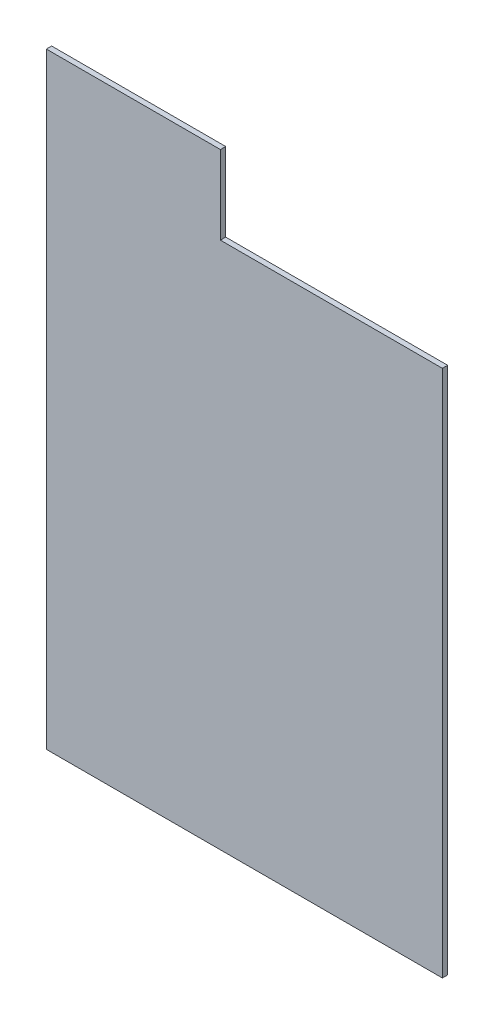
ISO-10303-21;
HEADER;
FILE_DESCRIPTION(('STEP AP214'),'2;1');
FILE_NAME('part.step','',(''),(''),'','','');
FILE_SCHEMA(('AUTOMOTIVE_DESIGN { 1 0 10303 214 1 1 1 1 }'));
ENDSEC;
DATA;
#1=APPLICATION_CONTEXT('core data for automotive mechanical design processes');
#2=APPLICATION_PROTOCOL_DEFINITION('international standard','automotive_design',2000,#1);
#3=PRODUCT_CONTEXT('',#1,'mechanical');
#4=PRODUCT('Part','Part','',(#3));
#5=PRODUCT_RELATED_PRODUCT_CATEGORY('part','',(#4));
#6=PRODUCT_DEFINITION_FORMATION('','',#4);
#7=PRODUCT_DEFINITION_CONTEXT('part definition',#1,'design');
#8=PRODUCT_DEFINITION('design','',#6,#7);
#9=PRODUCT_DEFINITION_SHAPE('','',#8);
#10=(LENGTH_UNIT() NAMED_UNIT(*) SI_UNIT(.MILLI.,.METRE.));
#11=(NAMED_UNIT(*) PLANE_ANGLE_UNIT() SI_UNIT($,.RADIAN.));
#12=(NAMED_UNIT(*) SI_UNIT($,.STERADIAN.) SOLID_ANGLE_UNIT());
#13=UNCERTAINTY_MEASURE_WITH_UNIT(LENGTH_MEASURE(1.E-05),#10,'distance_accuracy_value','');
#14=(GEOMETRIC_REPRESENTATION_CONTEXT(3) GLOBAL_UNCERTAINTY_ASSIGNED_CONTEXT((#13)) GLOBAL_UNIT_ASSIGNED_CONTEXT((#10,
#11,#12)) REPRESENTATION_CONTEXT('',''));
#15=CARTESIAN_POINT('',(0.,0.,0.));
#16=DIRECTION('',(0.,0.,1.));
#17=DIRECTION('',(1.,0.,0.));
#18=AXIS2_PLACEMENT_3D('',#15,#16,#17);
#19=CARTESIAN_POINT('',(0.,0.,1.));
#20=DIRECTION('',(0.,1.,0.));
#21=DIRECTION('',(0.,0.,1.));
#22=AXIS2_PLACEMENT_3D('',#19,#20,#21);
#23=PLANE('',#22);
#24=DIRECTION('',(1.,0.,0.));
#25=VECTOR('',#24,1.);
#26=CARTESIAN_POINT('',(0.,0.,0.));
#27=LINE('',#26,#25);
#28=CARTESIAN_POINT('',(0.,0.,0.));
#29=VERTEX_POINT('',#28);
#30=CARTESIAN_POINT('',(75.,0.,0.));
#31=VERTEX_POINT('',#30);
#32=EDGE_CURVE('E121',#29,#31,#27,.T.);
#33=ORIENTED_EDGE('',*,*,#32,.T.);
#34=DIRECTION('',(0.,0.,-1.));
#35=VECTOR('',#34,1.);
#36=CARTESIAN_POINT('',(75.,0.,1.));
#37=LINE('',#36,#35);
#38=CARTESIAN_POINT('',(75.,0.,1.));
#39=VERTEX_POINT('',#38);
#40=EDGE_CURVE('E41',#39,#31,#37,.T.);
#41=ORIENTED_EDGE('',*,*,#40,.F.);
#42=DIRECTION('',(1.,0.,0.));
#43=VECTOR('',#42,1.);
#44=CARTESIAN_POINT('',(0.,0.,1.));
#45=LINE('',#44,#43);
#46=CARTESIAN_POINT('',(0.,0.,1.));
#47=VERTEX_POINT('',#46);
#48=EDGE_CURVE('E87',#47,#39,#45,.T.);
#49=ORIENTED_EDGE('',*,*,#48,.F.);
#50=DIRECTION('',(0.,0.,-1.));
#51=VECTOR('',#50,1.);
#52=CARTESIAN_POINT('',(0.,0.,1.));
#53=LINE('',#52,#51);
#54=EDGE_CURVE('E11',#47,#29,#53,.T.);
#55=ORIENTED_EDGE('',*,*,#54,.T.);
#56=EDGE_LOOP('',(#33,#41,#49,#55));
#57=FACE_BOUND('',#56,.T.);
#58=ADVANCED_FACE('F33',(#57),#23,.F.);
#59=CARTESIAN_POINT('',(75.,0.,1.));
#60=DIRECTION('',(-1.,0.,0.));
#61=DIRECTION('',(0.,0.,1.));
#62=AXIS2_PLACEMENT_3D('',#59,#60,#61);
#63=PLANE('',#62);
#64=DIRECTION('',(0.,1.,0.));
#65=VECTOR('',#64,1.);
#66=CARTESIAN_POINT('',(75.,0.,0.));
#67=LINE('',#66,#65);
#68=CARTESIAN_POINT('',(75.,100.,0.));
#69=VERTEX_POINT('',#68);
#70=EDGE_CURVE('E123',#31,#69,#67,.T.);
#71=ORIENTED_EDGE('',*,*,#70,.T.);
#72=DIRECTION('',(0.,0.,-1.));
#73=VECTOR('',#72,1.);
#74=CARTESIAN_POINT('',(75.,100.,1.));
#75=LINE('',#74,#73);
#76=CARTESIAN_POINT('',(75.,100.,1.));
#77=VERTEX_POINT('',#76);
#78=EDGE_CURVE('E110',#77,#69,#75,.T.);
#79=ORIENTED_EDGE('',*,*,#78,.F.);
#80=DIRECTION('',(0.,1.,0.));
#81=VECTOR('',#80,1.);
#82=CARTESIAN_POINT('',(75.,0.,1.));
#83=LINE('',#82,#81);
#84=EDGE_CURVE('E101',#39,#77,#83,.T.);
#85=ORIENTED_EDGE('',*,*,#84,.F.);
#86=ORIENTED_EDGE('',*,*,#40,.T.);
#87=EDGE_LOOP('',(#71,#79,#85,#86));
#88=FACE_BOUND('',#87,.T.);
#89=ADVANCED_FACE('F135',(#88),#63,.F.);
#90=CARTESIAN_POINT('',(32.9665255734644,100.,1.));
#91=DIRECTION('',(0.,-1.,0.));
#92=DIRECTION('',(0.,0.,-1.));
#93=AXIS2_PLACEMENT_3D('',#90,#91,#92);
#94=PLANE('',#93);
#95=DIRECTION('',(-1.,0.,0.));
#96=VECTOR('',#95,1.);
#97=CARTESIAN_POINT('',(32.9665255734644,100.,0.));
#98=LINE('',#97,#96);
#99=CARTESIAN_POINT('',(32.9665255734644,100.,0.));
#100=VERTEX_POINT('',#99);
#101=EDGE_CURVE('E109',#69,#100,#98,.T.);
#102=ORIENTED_EDGE('',*,*,#101,.T.);
#103=DIRECTION('',(0.,0.,-1.));
#104=VECTOR('',#103,1.);
#105=CARTESIAN_POINT('',(32.9665255734644,100.,1.));
#106=LINE('',#105,#104);
#107=CARTESIAN_POINT('',(32.9665255734644,100.,1.));
#108=VERTEX_POINT('',#107);
#109=EDGE_CURVE('E106',#108,#100,#106,.T.);
#110=ORIENTED_EDGE('',*,*,#109,.F.);
#111=DIRECTION('',(-1.,0.,0.));
#112=VECTOR('',#111,1.);
#113=CARTESIAN_POINT('',(32.9665255734644,100.,1.));
#114=LINE('',#113,#112);
#115=EDGE_CURVE('E95',#77,#108,#114,.T.);
#116=ORIENTED_EDGE('',*,*,#115,.F.);
#117=ORIENTED_EDGE('',*,*,#78,.T.);
#118=EDGE_LOOP('',(#102,#110,#116,#117));
#119=FACE_BOUND('',#118,.T.);
#120=ADVANCED_FACE('F107',(#119),#94,.F.);
#121=CARTESIAN_POINT('',(32.9665255734644,114.863880064331,1.));
#122=DIRECTION('',(-1.,0.,0.));
#123=DIRECTION('',(0.,0.,1.));
#124=AXIS2_PLACEMENT_3D('',#121,#122,#123);
#125=PLANE('',#124);
#126=DIRECTION('',(0.,1.,0.));
#127=VECTOR('',#126,1.);
#128=CARTESIAN_POINT('',(32.9665255734644,114.863880064331,0.));
#129=LINE('',#128,#127);
#130=CARTESIAN_POINT('',(32.9665255734644,114.863880064331,0.));
#131=VERTEX_POINT('',#130);
#132=EDGE_CURVE('E73',#100,#131,#129,.T.);
#133=ORIENTED_EDGE('',*,*,#132,.T.);
#134=DIRECTION('',(0.,0.,-1.));
#135=VECTOR('',#134,1.);
#136=CARTESIAN_POINT('',(32.9665255734644,114.863880064331,1.));
#137=LINE('',#136,#135);
#138=CARTESIAN_POINT('',(32.9665255734644,114.863880064331,1.));
#139=VERTEX_POINT('',#138);
#140=EDGE_CURVE('E111',#139,#131,#137,.T.);
#141=ORIENTED_EDGE('',*,*,#140,.F.);
#142=DIRECTION('',(0.,1.,0.));
#143=VECTOR('',#142,1.);
#144=CARTESIAN_POINT('',(32.9665255734644,114.863880064331,1.));
#145=LINE('',#144,#143);
#146=EDGE_CURVE('E99',#108,#139,#145,.T.);
#147=ORIENTED_EDGE('',*,*,#146,.F.);
#148=ORIENTED_EDGE('',*,*,#109,.T.);
#149=EDGE_LOOP('',(#133,#141,#147,#148));
#150=FACE_BOUND('',#149,.T.);
#151=ADVANCED_FACE('F113',(#150),#125,.F.);
#152=CARTESIAN_POINT('',(0.,114.863880064331,1.));
#153=DIRECTION('',(0.,-1.,0.));
#154=DIRECTION('',(0.,0.,-1.));
#155=AXIS2_PLACEMENT_3D('',#152,#153,#154);
#156=PLANE('',#155);
#157=DIRECTION('',(-1.,0.,0.));
#158=VECTOR('',#157,1.);
#159=CARTESIAN_POINT('',(0.,114.863880064331,0.));
#160=LINE('',#159,#158);
#161=CARTESIAN_POINT('',(0.,114.863880064331,0.));
#162=VERTEX_POINT('',#161);
#163=EDGE_CURVE('E80',#131,#162,#160,.T.);
#164=ORIENTED_EDGE('',*,*,#163,.T.);
#165=DIRECTION('',(0.,0.,-1.));
#166=VECTOR('',#165,1.);
#167=CARTESIAN_POINT('',(0.,114.863880064331,1.));
#168=LINE('',#167,#166);
#169=CARTESIAN_POINT('',(0.,114.863880064331,1.));
#170=VERTEX_POINT('',#169);
#171=EDGE_CURVE('E117',#170,#162,#168,.T.);
#172=ORIENTED_EDGE('',*,*,#171,.F.);
#173=DIRECTION('',(-1.,0.,0.));
#174=VECTOR('',#173,1.);
#175=CARTESIAN_POINT('',(0.,114.863880064331,1.));
#176=LINE('',#175,#174);
#177=EDGE_CURVE('E115',#139,#170,#176,.T.);
#178=ORIENTED_EDGE('',*,*,#177,.F.);
#179=ORIENTED_EDGE('',*,*,#140,.T.);
#180=EDGE_LOOP('',(#164,#172,#178,#179));
#181=FACE_BOUND('',#180,.T.);
#182=ADVANCED_FACE('F141',(#181),#156,.F.);
#183=CARTESIAN_POINT('',(0.,100.,1.));
#184=DIRECTION('',(1.,0.,0.));
#185=DIRECTION('',(0.,0.,-1.));
#186=AXIS2_PLACEMENT_3D('',#183,#184,#185);
#187=PLANE('',#186);
#188=DIRECTION('',(0.,-1.,0.));
#189=VECTOR('',#188,1.);
#190=CARTESIAN_POINT('',(0.,100.,0.));
#191=LINE('',#190,#189);
#192=EDGE_CURVE('E128',#162,#29,#191,.T.);
#193=ORIENTED_EDGE('',*,*,#192,.T.);
#194=ORIENTED_EDGE('',*,*,#54,.F.);
#195=DIRECTION('',(0.,-1.,0.));
#196=VECTOR('',#195,1.);
#197=CARTESIAN_POINT('',(0.,0.,1.));
#198=LINE('',#197,#196);
#199=EDGE_CURVE('E49',#170,#47,#198,.T.);
#200=ORIENTED_EDGE('',*,*,#199,.F.);
#201=ORIENTED_EDGE('',*,*,#171,.T.);
#202=EDGE_LOOP('',(#193,#194,#200,#201));
#203=FACE_BOUND('',#202,.T.);
#204=ADVANCED_FACE('F140',(#203),#187,.F.);
#205=CARTESIAN_POINT('',(0.,0.,1.));
#206=DIRECTION('',(0.,0.,-1.));
#207=DIRECTION('',(-1.,0.,0.));
#208=AXIS2_PLACEMENT_3D('',#205,#206,#207);
#209=PLANE('',#208);
#210=ORIENTED_EDGE('',*,*,#199,.T.);
#211=ORIENTED_EDGE('',*,*,#48,.T.);
#212=ORIENTED_EDGE('',*,*,#84,.T.);
#213=ORIENTED_EDGE('',*,*,#115,.T.);
#214=ORIENTED_EDGE('',*,*,#146,.T.);
#215=ORIENTED_EDGE('',*,*,#177,.T.);
#216=EDGE_LOOP('',(#210,#211,#212,#213,#214,#215));
#217=FACE_BOUND('',#216,.T.);
#218=ADVANCED_FACE('F97',(#217),#209,.F.);
#219=CARTESIAN_POINT('',(0.,0.,0.));
#220=DIRECTION('',(0.,0.,-1.));
#221=DIRECTION('',(-1.,0.,0.));
#222=AXIS2_PLACEMENT_3D('',#219,#220,#221);
#223=PLANE('',#222);
#224=ORIENTED_EDGE('',*,*,#32,.F.);
#225=ORIENTED_EDGE('',*,*,#192,.F.);
#226=ORIENTED_EDGE('',*,*,#163,.F.);
#227=ORIENTED_EDGE('',*,*,#132,.F.);
#228=ORIENTED_EDGE('',*,*,#101,.F.);
#229=ORIENTED_EDGE('',*,*,#70,.F.);
#230=EDGE_LOOP('',(#224,#225,#226,#227,#228,#229));
#231=FACE_BOUND('',#230,.T.);
#232=ADVANCED_FACE('F138',(#231),#223,.T.);
#233=CLOSED_SHELL('',(#58,#89,#120,#151,#182,#204,#218,#232));
#234=MANIFOLD_SOLID_BREP('B2',#233);
#235=ADVANCED_BREP_SHAPE_REPRESENTATION('',(#18,#234),#14);
#236=SHAPE_DEFINITION_REPRESENTATION(#9,#235);
ENDSEC;
END-ISO-10303-21;
